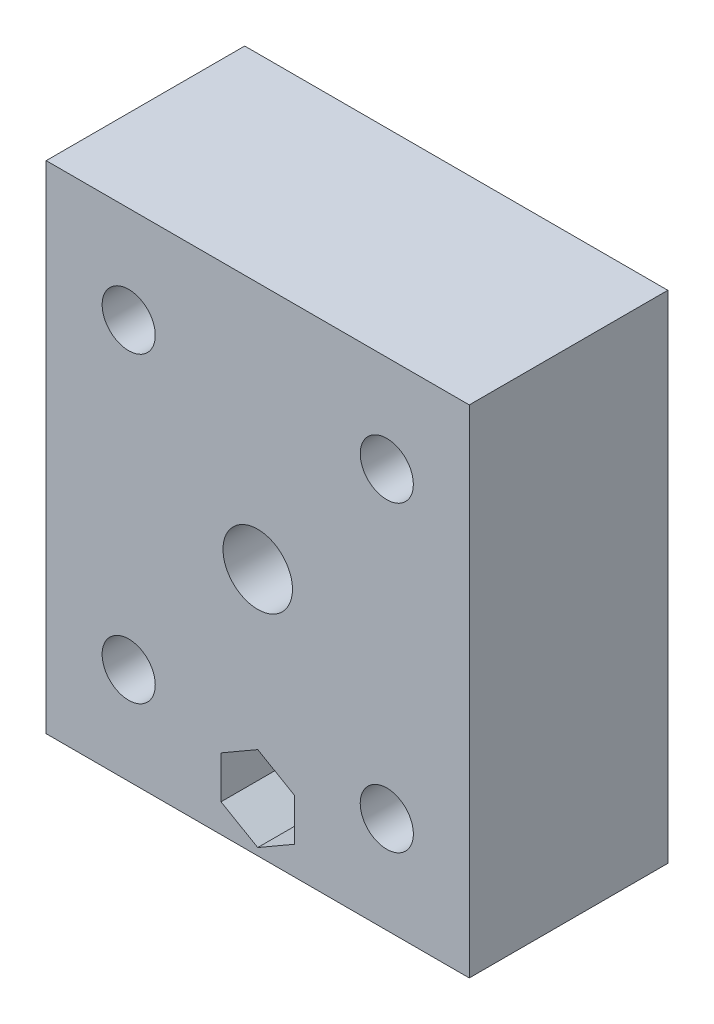
ISO-10303-21;
HEADER;
FILE_DESCRIPTION(('STEP AP214'),'2;1');
FILE_NAME('part.step','',(''),(''),'','','');
FILE_SCHEMA(('AUTOMOTIVE_DESIGN { 1 0 10303 214 1 1 1 1 }'));
ENDSEC;
DATA;
#1=APPLICATION_CONTEXT('core data for automotive mechanical design processes');
#2=APPLICATION_PROTOCOL_DEFINITION('international standard','automotive_design',2000,#1);
#3=PRODUCT_CONTEXT('',#1,'mechanical');
#4=PRODUCT('Part','Part','',(#3));
#5=PRODUCT_RELATED_PRODUCT_CATEGORY('part','',(#4));
#6=PRODUCT_DEFINITION_FORMATION('','',#4);
#7=PRODUCT_DEFINITION_CONTEXT('part definition',#1,'design');
#8=PRODUCT_DEFINITION('design','',#6,#7);
#9=PRODUCT_DEFINITION_SHAPE('','',#8);
#10=(LENGTH_UNIT() NAMED_UNIT(*) SI_UNIT(.MILLI.,.METRE.));
#11=(NAMED_UNIT(*) PLANE_ANGLE_UNIT() SI_UNIT($,.RADIAN.));
#12=(NAMED_UNIT(*) SI_UNIT($,.STERADIAN.) SOLID_ANGLE_UNIT());
#13=UNCERTAINTY_MEASURE_WITH_UNIT(LENGTH_MEASURE(1.E-05),#10,'distance_accuracy_value','');
#14=(GEOMETRIC_REPRESENTATION_CONTEXT(3) GLOBAL_UNCERTAINTY_ASSIGNED_CONTEXT((#13)) GLOBAL_UNIT_ASSIGNED_CONTEXT((#10,
#11,#12)) REPRESENTATION_CONTEXT('',''));
#15=CARTESIAN_POINT('',(0.,0.,0.));
#16=DIRECTION('',(0.,0.,1.));
#17=DIRECTION('',(1.,0.,0.));
#18=AXIS2_PLACEMENT_3D('',#15,#16,#17);
#19=CARTESIAN_POINT('',(0.,0.,20.));
#20=DIRECTION('',(0.,0.,-1.));
#21=DIRECTION('',(-1.,0.,0.));
#22=AXIS2_PLACEMENT_3D('',#19,#20,#21);
#23=PLANE('',#22);
#24=CARTESIAN_POINT('',(0.,0.,20.));
#25=DIRECTION('',(0.,0.,1.));
#26=DIRECTION('',(1.,0.,0.));
#27=AXIS2_PLACEMENT_3D('',#24,#25,#26);
#28=CIRCLE('',#27,3.5);
#29=CARTESIAN_POINT('',(3.5,0.,20.));
#30=VERTEX_POINT('',#29);
#31=EDGE_CURVE('E164',#30,#30,#28,.T.);
#32=ORIENTED_EDGE('',*,*,#31,.F.);
#33=EDGE_LOOP('',(#32));
#34=FACE_BOUND('',#33,.T.);
#35=DIRECTION('',(0.,1.,0.));
#36=VECTOR('',#35,1.);
#37=CARTESIAN_POINT('',(-3.69999999999999,-22.1361959960016,20.));
#38=LINE('',#37,#36);
#39=CARTESIAN_POINT('',(-3.69999999999999,-22.1361959960016,20.));
#40=VERTEX_POINT('',#39);
#41=CARTESIAN_POINT('',(-3.69999999999999,-17.8638040039984,20.));
#42=VERTEX_POINT('',#41);
#43=EDGE_CURVE('E146',#40,#42,#38,.T.);
#44=ORIENTED_EDGE('',*,*,#43,.T.);
#45=DIRECTION('',(0.866025403784439,0.5,0.));
#46=VECTOR('',#45,1.);
#47=CARTESIAN_POINT('',(-3.69999999999999,-17.8638040039984,20.));
#48=LINE('',#47,#46);
#49=CARTESIAN_POINT('',(0.,-15.7276080079968,20.));
#50=VERTEX_POINT('',#49);
#51=EDGE_CURVE('E137',#42,#50,#48,.T.);
#52=ORIENTED_EDGE('',*,*,#51,.T.);
#53=DIRECTION('',(0.866025403784439,-0.499999999999999,0.));
#54=VECTOR('',#53,1.);
#55=CARTESIAN_POINT('',(0.,-15.7276080079968,20.));
#56=LINE('',#55,#54);
#57=CARTESIAN_POINT('',(3.7,-17.8638040039984,20.));
#58=VERTEX_POINT('',#57);
#59=EDGE_CURVE('E149',#50,#58,#56,.T.);
#60=ORIENTED_EDGE('',*,*,#59,.T.);
#61=DIRECTION('',(0.,-1.,0.));
#62=VECTOR('',#61,1.);
#63=CARTESIAN_POINT('',(3.7,-17.8638040039984,20.));
#64=LINE('',#63,#62);
#65=CARTESIAN_POINT('',(3.7,-22.1361959960016,20.));
#66=VERTEX_POINT('',#65);
#67=EDGE_CURVE('E62',#58,#66,#64,.T.);
#68=ORIENTED_EDGE('',*,*,#67,.T.);
#69=DIRECTION('',(-0.866025403784439,-0.5,0.));
#70=VECTOR('',#69,1.);
#71=CARTESIAN_POINT('',(3.7,-22.1361959960016,20.));
#72=LINE('',#71,#70);
#73=CARTESIAN_POINT('',(0.,-24.2723919920032,20.));
#74=VERTEX_POINT('',#73);
#75=EDGE_CURVE('E168',#66,#74,#72,.T.);
#76=ORIENTED_EDGE('',*,*,#75,.T.);
#77=DIRECTION('',(-0.866025403784439,0.5,0.));
#78=VECTOR('',#77,1.);
#79=CARTESIAN_POINT('',(0.,-24.2723919920032,20.));
#80=LINE('',#79,#78);
#81=EDGE_CURVE('E172',#74,#40,#80,.T.);
#82=ORIENTED_EDGE('',*,*,#81,.T.);
#83=EDGE_LOOP('',(#44,#52,#60,#68,#76,#82));
#84=FACE_BOUND('',#83,.T.);
#85=DIRECTION('',(0.,-1.,0.));
#86=VECTOR('',#85,1.);
#87=CARTESIAN_POINT('',(-21.3114754098361,25.,20.));
#88=LINE('',#87,#86);
#89=CARTESIAN_POINT('',(-21.3114754098361,25.,20.));
#90=VERTEX_POINT('',#89);
#91=CARTESIAN_POINT('',(-21.3114754098361,-25.,20.));
#92=VERTEX_POINT('',#91);
#93=EDGE_CURVE('E253',#90,#92,#88,.T.);
#94=ORIENTED_EDGE('',*,*,#93,.T.);
#95=DIRECTION('',(1.,0.,0.));
#96=VECTOR('',#95,1.);
#97=CARTESIAN_POINT('',(21.3114754098361,-25.,20.));
#98=LINE('',#97,#96);
#99=CARTESIAN_POINT('',(21.3114754098361,-25.,20.));
#100=VERTEX_POINT('',#99);
#101=EDGE_CURVE('E99',#92,#100,#98,.T.);
#102=ORIENTED_EDGE('',*,*,#101,.T.);
#103=DIRECTION('',(0.,1.,0.));
#104=VECTOR('',#103,1.);
#105=CARTESIAN_POINT('',(21.3114754098361,25.,20.));
#106=LINE('',#105,#104);
#107=CARTESIAN_POINT('',(21.3114754098361,25.,20.));
#108=VERTEX_POINT('',#107);
#109=EDGE_CURVE('E258',#100,#108,#106,.T.);
#110=ORIENTED_EDGE('',*,*,#109,.T.);
#111=DIRECTION('',(-1.,0.,0.));
#112=VECTOR('',#111,1.);
#113=CARTESIAN_POINT('',(21.3114754098361,25.,20.));
#114=LINE('',#113,#112);
#115=EDGE_CURVE('E71',#108,#90,#114,.T.);
#116=ORIENTED_EDGE('',*,*,#115,.T.);
#117=EDGE_LOOP('',(#94,#102,#110,#116));
#118=FACE_BOUND('',#117,.T.);
#119=CARTESIAN_POINT('',(-13.,-15.25,20.));
#120=DIRECTION('',(0.,0.,1.));
#121=DIRECTION('',(1.,0.,0.));
#122=AXIS2_PLACEMENT_3D('',#119,#120,#121);
#123=CIRCLE('',#122,2.67701813439658);
#124=CARTESIAN_POINT('',(-10.3229818656034,-15.25,20.));
#125=VERTEX_POINT('',#124);
#126=EDGE_CURVE('E245',#125,#125,#123,.T.);
#127=ORIENTED_EDGE('',*,*,#126,.F.);
#128=EDGE_LOOP('',(#127));
#129=FACE_BOUND('',#128,.T.);
#130=CARTESIAN_POINT('',(13.,-15.25,20.));
#131=DIRECTION('',(0.,0.,1.));
#132=DIRECTION('',(-1.,0.,0.));
#133=AXIS2_PLACEMENT_3D('',#130,#131,#132);
#134=CIRCLE('',#133,2.67701813439658);
#135=CARTESIAN_POINT('',(10.3229818656034,-15.25,20.));
#136=VERTEX_POINT('',#135);
#137=EDGE_CURVE('E237',#136,#136,#134,.T.);
#138=ORIENTED_EDGE('',*,*,#137,.F.);
#139=EDGE_LOOP('',(#138));
#140=FACE_BOUND('',#139,.T.);
#141=CARTESIAN_POINT('',(13.,15.25,20.));
#142=DIRECTION('',(0.,0.,1.));
#143=DIRECTION('',(1.,0.,0.));
#144=AXIS2_PLACEMENT_3D('',#141,#142,#143);
#145=CIRCLE('',#144,2.67701813439658);
#146=CARTESIAN_POINT('',(15.6770181343966,15.25,20.));
#147=VERTEX_POINT('',#146);
#148=EDGE_CURVE('E229',#147,#147,#145,.T.);
#149=ORIENTED_EDGE('',*,*,#148,.F.);
#150=EDGE_LOOP('',(#149));
#151=FACE_BOUND('',#150,.T.);
#152=CARTESIAN_POINT('',(-13.,15.25,20.));
#153=DIRECTION('',(0.,0.,1.));
#154=DIRECTION('',(-1.,0.,0.));
#155=AXIS2_PLACEMENT_3D('',#152,#153,#154);
#156=CIRCLE('',#155,2.67701813439658);
#157=CARTESIAN_POINT('',(-15.6770181343966,15.25,20.));
#158=VERTEX_POINT('',#157);
#159=EDGE_CURVE('E221',#158,#158,#156,.T.);
#160=ORIENTED_EDGE('',*,*,#159,.F.);
#161=EDGE_LOOP('',(#160));
#162=FACE_BOUND('',#161,.T.);
#163=ADVANCED_FACE('F44',(#34,#84,#118,#129,#140,#151,#162),#23,.F.);
#164=CARTESIAN_POINT('',(0.,0.,0.));
#165=DIRECTION('',(0.,0.,-1.));
#166=DIRECTION('',(-1.,0.,0.));
#167=AXIS2_PLACEMENT_3D('',#164,#165,#166);
#168=PLANE('',#167);
#169=CARTESIAN_POINT('',(0.,-20.,0.));
#170=DIRECTION('',(0.,0.,-1.));
#171=DIRECTION('',(-1.,0.,0.));
#172=AXIS2_PLACEMENT_3D('',#169,#170,#171);
#173=CIRCLE('',#172,2.2);
#174=CARTESIAN_POINT('',(-2.2,-20.,0.));
#175=VERTEX_POINT('',#174);
#176=EDGE_CURVE('E208',#175,#175,#173,.T.);
#177=ORIENTED_EDGE('',*,*,#176,.F.);
#178=EDGE_LOOP('',(#177));
#179=FACE_BOUND('',#178,.T.);
#180=CARTESIAN_POINT('',(0.,0.,0.));
#181=DIRECTION('',(0.,0.,1.));
#182=DIRECTION('',(1.,0.,0.));
#183=AXIS2_PLACEMENT_3D('',#180,#181,#182);
#184=CIRCLE('',#183,5.025);
#185=CARTESIAN_POINT('',(5.025,0.,0.));
#186=VERTEX_POINT('',#185);
#187=EDGE_CURVE('E212',#186,#186,#184,.T.);
#188=ORIENTED_EDGE('',*,*,#187,.T.);
#189=EDGE_LOOP('',(#188));
#190=FACE_BOUND('',#189,.T.);
#191=CARTESIAN_POINT('',(13.,15.25,0.));
#192=DIRECTION('',(0.,0.,1.));
#193=DIRECTION('',(1.,0.,0.));
#194=AXIS2_PLACEMENT_3D('',#191,#192,#193);
#195=CIRCLE('',#194,2.67701813439658);
#196=CARTESIAN_POINT('',(15.6770181343966,15.25,0.));
#197=VERTEX_POINT('',#196);
#198=EDGE_CURVE('E225',#197,#197,#195,.T.);
#199=ORIENTED_EDGE('',*,*,#198,.T.);
#200=EDGE_LOOP('',(#199));
#201=FACE_BOUND('',#200,.T.);
#202=CARTESIAN_POINT('',(-13.,-15.25,0.));
#203=DIRECTION('',(0.,0.,1.));
#204=DIRECTION('',(1.,0.,0.));
#205=AXIS2_PLACEMENT_3D('',#202,#203,#204);
#206=CIRCLE('',#205,2.67701813439658);
#207=CARTESIAN_POINT('',(-10.3229818656034,-15.25,0.));
#208=VERTEX_POINT('',#207);
#209=EDGE_CURVE('E241',#208,#208,#206,.T.);
#210=ORIENTED_EDGE('',*,*,#209,.T.);
#211=EDGE_LOOP('',(#210));
#212=FACE_BOUND('',#211,.T.);
#213=DIRECTION('',(0.,-1.,0.));
#214=VECTOR('',#213,1.);
#215=CARTESIAN_POINT('',(-21.3114754098361,25.,0.));
#216=LINE('',#215,#214);
#217=CARTESIAN_POINT('',(-21.3114754098361,25.,0.));
#218=VERTEX_POINT('',#217);
#219=CARTESIAN_POINT('',(-21.3114754098361,-25.,0.));
#220=VERTEX_POINT('',#219);
#221=EDGE_CURVE('E249',#218,#220,#216,.T.);
#222=ORIENTED_EDGE('',*,*,#221,.F.);
#223=DIRECTION('',(-1.,0.,0.));
#224=VECTOR('',#223,1.);
#225=CARTESIAN_POINT('',(21.3114754098361,25.,0.));
#226=LINE('',#225,#224);
#227=CARTESIAN_POINT('',(21.3114754098361,25.,0.));
#228=VERTEX_POINT('',#227);
#229=EDGE_CURVE('E92',#228,#218,#226,.T.);
#230=ORIENTED_EDGE('',*,*,#229,.F.);
#231=DIRECTION('',(0.,1.,0.));
#232=VECTOR('',#231,1.);
#233=CARTESIAN_POINT('',(21.3114754098361,25.,0.));
#234=LINE('',#233,#232);
#235=CARTESIAN_POINT('',(21.3114754098361,-25.,0.));
#236=VERTEX_POINT('',#235);
#237=EDGE_CURVE('E270',#236,#228,#234,.T.);
#238=ORIENTED_EDGE('',*,*,#237,.F.);
#239=DIRECTION('',(1.,0.,0.));
#240=VECTOR('',#239,1.);
#241=CARTESIAN_POINT('',(21.3114754098361,-25.,0.));
#242=LINE('',#241,#240);
#243=EDGE_CURVE('E267',#220,#236,#242,.T.);
#244=ORIENTED_EDGE('',*,*,#243,.F.);
#245=EDGE_LOOP('',(#222,#230,#238,#244));
#246=FACE_BOUND('',#245,.T.);
#247=CARTESIAN_POINT('',(13.,-15.25,0.));
#248=DIRECTION('',(0.,0.,1.));
#249=DIRECTION('',(-1.,0.,0.));
#250=AXIS2_PLACEMENT_3D('',#247,#248,#249);
#251=CIRCLE('',#250,2.67701813439658);
#252=CARTESIAN_POINT('',(10.3229818656034,-15.25,0.));
#253=VERTEX_POINT('',#252);
#254=EDGE_CURVE('E233',#253,#253,#251,.T.);
#255=ORIENTED_EDGE('',*,*,#254,.T.);
#256=EDGE_LOOP('',(#255));
#257=FACE_BOUND('',#256,.T.);
#258=CARTESIAN_POINT('',(-13.,15.25,0.));
#259=DIRECTION('',(0.,0.,1.));
#260=DIRECTION('',(-1.,0.,0.));
#261=AXIS2_PLACEMENT_3D('',#258,#259,#260);
#262=CIRCLE('',#261,2.67701813439658);
#263=CARTESIAN_POINT('',(-15.6770181343966,15.25,0.));
#264=VERTEX_POINT('',#263);
#265=EDGE_CURVE('E217',#264,#264,#262,.T.);
#266=ORIENTED_EDGE('',*,*,#265,.T.);
#267=EDGE_LOOP('',(#266));
#268=FACE_BOUND('',#267,.T.);
#269=ADVANCED_FACE('F304',(#179,#190,#201,#212,#246,#257,#268),#168,.T.);
#270=CARTESIAN_POINT('',(-21.3114754098361,25.,20.));
#271=DIRECTION('',(1.,0.,0.));
#272=DIRECTION('',(0.,0.,-1.));
#273=AXIS2_PLACEMENT_3D('',#270,#271,#272);
#274=PLANE('',#273);
#275=ORIENTED_EDGE('',*,*,#221,.T.);
#276=DIRECTION('',(0.,0.,-1.));
#277=VECTOR('',#276,1.);
#278=CARTESIAN_POINT('',(-21.3114754098361,-25.,20.));
#279=LINE('',#278,#277);
#280=EDGE_CURVE('E11',#92,#220,#279,.T.);
#281=ORIENTED_EDGE('',*,*,#280,.F.);
#282=ORIENTED_EDGE('',*,*,#93,.F.);
#283=DIRECTION('',(0.,0.,-1.));
#284=VECTOR('',#283,1.);
#285=CARTESIAN_POINT('',(-21.3114754098361,25.,20.));
#286=LINE('',#285,#284);
#287=EDGE_CURVE('E263',#90,#218,#286,.T.);
#288=ORIENTED_EDGE('',*,*,#287,.T.);
#289=EDGE_LOOP('',(#275,#281,#282,#288));
#290=FACE_BOUND('',#289,.T.);
#291=ADVANCED_FACE('F46',(#290),#274,.F.);
#292=CARTESIAN_POINT('',(21.3114754098361,-25.,20.));
#293=DIRECTION('',(0.,1.,0.));
#294=DIRECTION('',(0.,0.,1.));
#295=AXIS2_PLACEMENT_3D('',#292,#293,#294);
#296=PLANE('',#295);
#297=ORIENTED_EDGE('',*,*,#243,.T.);
#298=DIRECTION('',(0.,0.,-1.));
#299=VECTOR('',#298,1.);
#300=CARTESIAN_POINT('',(21.3114754098361,-25.,20.));
#301=LINE('',#300,#299);
#302=EDGE_CURVE('E54',#100,#236,#301,.T.);
#303=ORIENTED_EDGE('',*,*,#302,.F.);
#304=ORIENTED_EDGE('',*,*,#101,.F.);
#305=ORIENTED_EDGE('',*,*,#280,.T.);
#306=EDGE_LOOP('',(#297,#303,#304,#305));
#307=FACE_BOUND('',#306,.T.);
#308=ADVANCED_FACE('F324',(#307),#296,.F.);
#309=CARTESIAN_POINT('',(21.3114754098361,25.,20.));
#310=DIRECTION('',(-1.,0.,0.));
#311=DIRECTION('',(0.,0.,1.));
#312=AXIS2_PLACEMENT_3D('',#309,#310,#311);
#313=PLANE('',#312);
#314=ORIENTED_EDGE('',*,*,#237,.T.);
#315=DIRECTION('',(0.,0.,-1.));
#316=VECTOR('',#315,1.);
#317=CARTESIAN_POINT('',(21.3114754098361,25.,20.));
#318=LINE('',#317,#316);
#319=EDGE_CURVE('E277',#108,#228,#318,.T.);
#320=ORIENTED_EDGE('',*,*,#319,.F.);
#321=ORIENTED_EDGE('',*,*,#109,.F.);
#322=ORIENTED_EDGE('',*,*,#302,.T.);
#323=EDGE_LOOP('',(#314,#320,#321,#322));
#324=FACE_BOUND('',#323,.T.);
#325=ADVANCED_FACE('F322',(#324),#313,.F.);
#326=CARTESIAN_POINT('',(21.3114754098361,25.,20.));
#327=DIRECTION('',(0.,-1.,0.));
#328=DIRECTION('',(0.,0.,-1.));
#329=AXIS2_PLACEMENT_3D('',#326,#327,#328);
#330=PLANE('',#329);
#331=ORIENTED_EDGE('',*,*,#229,.T.);
#332=ORIENTED_EDGE('',*,*,#287,.F.);
#333=ORIENTED_EDGE('',*,*,#115,.F.);
#334=ORIENTED_EDGE('',*,*,#319,.T.);
#335=EDGE_LOOP('',(#331,#332,#333,#334));
#336=FACE_BOUND('',#335,.T.);
#337=ADVANCED_FACE('F319',(#336),#330,.F.);
#338=CARTESIAN_POINT('',(-13.,-15.25,20.));
#339=DIRECTION('',(0.,0.,-1.));
#340=DIRECTION('',(-1.,0.,0.));
#341=AXIS2_PLACEMENT_3D('',#338,#339,#340);
#342=CYLINDRICAL_SURFACE('',#341,2.67701813439658);
#343=ORIENTED_EDGE('',*,*,#126,.T.);
#344=EDGE_LOOP('',(#343));
#345=FACE_BOUND('',#344,.T.);
#346=ORIENTED_EDGE('',*,*,#209,.F.);
#347=EDGE_LOOP('',(#346));
#348=FACE_BOUND('',#347,.T.);
#349=ADVANCED_FACE('F316',(#345,#348),#342,.F.);
#350=CARTESIAN_POINT('',(13.,-15.25,20.));
#351=DIRECTION('',(0.,0.,-1.));
#352=DIRECTION('',(-1.,0.,0.));
#353=AXIS2_PLACEMENT_3D('',#350,#351,#352);
#354=CYLINDRICAL_SURFACE('',#353,2.67701813439658);
#355=ORIENTED_EDGE('',*,*,#137,.T.);
#356=EDGE_LOOP('',(#355));
#357=FACE_BOUND('',#356,.T.);
#358=ORIENTED_EDGE('',*,*,#254,.F.);
#359=EDGE_LOOP('',(#358));
#360=FACE_BOUND('',#359,.T.);
#361=ADVANCED_FACE('F362',(#357,#360),#354,.F.);
#362=CARTESIAN_POINT('',(13.,15.25,20.));
#363=DIRECTION('',(0.,0.,-1.));
#364=DIRECTION('',(-1.,0.,0.));
#365=AXIS2_PLACEMENT_3D('',#362,#363,#364);
#366=CYLINDRICAL_SURFACE('',#365,2.67701813439658);
#367=ORIENTED_EDGE('',*,*,#148,.T.);
#368=EDGE_LOOP('',(#367));
#369=FACE_BOUND('',#368,.T.);
#370=ORIENTED_EDGE('',*,*,#198,.F.);
#371=EDGE_LOOP('',(#370));
#372=FACE_BOUND('',#371,.T.);
#373=ADVANCED_FACE('F352',(#369,#372),#366,.F.);
#374=CARTESIAN_POINT('',(-13.,15.25,20.));
#375=DIRECTION('',(0.,0.,-1.));
#376=DIRECTION('',(-1.,0.,0.));
#377=AXIS2_PLACEMENT_3D('',#374,#375,#376);
#378=CYLINDRICAL_SURFACE('',#377,2.67701813439658);
#379=ORIENTED_EDGE('',*,*,#159,.T.);
#380=EDGE_LOOP('',(#379));
#381=FACE_BOUND('',#380,.T.);
#382=ORIENTED_EDGE('',*,*,#265,.F.);
#383=EDGE_LOOP('',(#382));
#384=FACE_BOUND('',#383,.T.);
#385=ADVANCED_FACE('F348',(#381,#384),#378,.F.);
#386=CARTESIAN_POINT('',(0.,0.,3.));
#387=DIRECTION('',(0.,0.,-1.));
#388=DIRECTION('',(-1.,0.,0.));
#389=AXIS2_PLACEMENT_3D('',#386,#387,#388);
#390=CYLINDRICAL_SURFACE('',#389,5.025);
#391=CARTESIAN_POINT('',(0.,0.,3.));
#392=DIRECTION('',(0.,0.,1.));
#393=DIRECTION('',(1.,0.,0.));
#394=AXIS2_PLACEMENT_3D('',#391,#392,#393);
#395=CIRCLE('',#394,5.025);
#396=CARTESIAN_POINT('',(5.025,0.,3.));
#397=VERTEX_POINT('',#396);
#398=EDGE_CURVE('E213',#397,#397,#395,.T.);
#399=ORIENTED_EDGE('',*,*,#398,.T.);
#400=EDGE_LOOP('',(#399));
#401=FACE_BOUND('',#400,.T.);
#402=ORIENTED_EDGE('',*,*,#187,.F.);
#403=EDGE_LOOP('',(#402));
#404=FACE_BOUND('',#403,.T.);
#405=ADVANCED_FACE('F351',(#401,#404),#390,.F.);
#406=CARTESIAN_POINT('',(0.,0.,3.));
#407=DIRECTION('',(0.,0.,1.));
#408=DIRECTION('',(1.,0.,0.));
#409=AXIS2_PLACEMENT_3D('',#406,#407,#408);
#410=PLANE('',#409);
#411=CARTESIAN_POINT('',(0.,0.,3.));
#412=DIRECTION('',(0.,0.,1.));
#413=DIRECTION('',(1.,0.,0.));
#414=AXIS2_PLACEMENT_3D('',#411,#412,#413);
#415=CIRCLE('',#414,3.5);
#416=CARTESIAN_POINT('',(3.5,0.,3.));
#417=VERTEX_POINT('',#416);
#418=EDGE_CURVE('E48',#417,#417,#415,.F.);
#419=ORIENTED_EDGE('',*,*,#418,.F.);
#420=EDGE_LOOP('',(#419));
#421=FACE_BOUND('',#420,.T.);
#422=ORIENTED_EDGE('',*,*,#398,.F.);
#423=EDGE_LOOP('',(#422));
#424=FACE_BOUND('',#423,.T.);
#425=ADVANCED_FACE('F299',(#421,#424),#410,.F.);
#426=CARTESIAN_POINT('',(0.,-20.,10.));
#427=DIRECTION('',(0.,0.,-1.));
#428=DIRECTION('',(-1.,0.,0.));
#429=AXIS2_PLACEMENT_3D('',#426,#427,#428);
#430=CYLINDRICAL_SURFACE('',#429,2.2);
#431=CARTESIAN_POINT('',(0.,-20.,7.));
#432=DIRECTION('',(0.,0.,-1.));
#433=DIRECTION('',(-1.,0.,0.));
#434=AXIS2_PLACEMENT_3D('',#431,#432,#433);
#435=CIRCLE('',#434,2.2);
#436=CARTESIAN_POINT('',(-2.2,-20.,7.));
#437=VERTEX_POINT('',#436);
#438=EDGE_CURVE('E196',#437,#437,#435,.F.);
#439=ORIENTED_EDGE('',*,*,#438,.T.);
#440=EDGE_LOOP('',(#439));
#441=FACE_BOUND('',#440,.T.);
#442=ORIENTED_EDGE('',*,*,#176,.T.);
#443=EDGE_LOOP('',(#442));
#444=FACE_BOUND('',#443,.T.);
#445=ADVANCED_FACE('F286',(#441,#444),#430,.F.);
#446=CARTESIAN_POINT('',(0.,0.,7.));
#447=DIRECTION('',(0.,0.,-1.));
#448=DIRECTION('',(-1.,0.,0.));
#449=AXIS2_PLACEMENT_3D('',#446,#447,#448);
#450=PLANE('',#449);
#451=DIRECTION('',(0.866025403784439,0.5,0.));
#452=VECTOR('',#451,1.);
#453=CARTESIAN_POINT('',(-3.69999999999999,-17.8638040039984,7.));
#454=LINE('',#453,#452);
#455=CARTESIAN_POINT('',(-3.69999999999999,-17.8638040039984,7.));
#456=VERTEX_POINT('',#455);
#457=CARTESIAN_POINT('',(0.,-15.7276080079968,7.));
#458=VERTEX_POINT('',#457);
#459=EDGE_CURVE('E140',#456,#458,#454,.T.);
#460=ORIENTED_EDGE('',*,*,#459,.F.);
#461=DIRECTION('',(0.,1.,0.));
#462=VECTOR('',#461,1.);
#463=CARTESIAN_POINT('',(-3.69999999999999,-22.1361959960016,7.));
#464=LINE('',#463,#462);
#465=CARTESIAN_POINT('',(-3.69999999999999,-22.1361959960016,7.));
#466=VERTEX_POINT('',#465);
#467=EDGE_CURVE('E157',#466,#456,#464,.T.);
#468=ORIENTED_EDGE('',*,*,#467,.F.);
#469=DIRECTION('',(-0.866025403784439,0.5,0.));
#470=VECTOR('',#469,1.);
#471=CARTESIAN_POINT('',(0.,-24.2723919920032,7.));
#472=LINE('',#471,#470);
#473=CARTESIAN_POINT('',(0.,-24.2723919920032,7.));
#474=VERTEX_POINT('',#473);
#475=EDGE_CURVE('E161',#474,#466,#472,.T.);
#476=ORIENTED_EDGE('',*,*,#475,.F.);
#477=DIRECTION('',(-0.866025403784439,-0.5,0.));
#478=VECTOR('',#477,1.);
#479=CARTESIAN_POINT('',(3.7,-22.1361959960016,7.));
#480=LINE('',#479,#478);
#481=CARTESIAN_POINT('',(3.7,-22.1361959960016,7.));
#482=VERTEX_POINT('',#481);
#483=EDGE_CURVE('E186',#482,#474,#480,.T.);
#484=ORIENTED_EDGE('',*,*,#483,.F.);
#485=DIRECTION('',(0.,-1.,0.));
#486=VECTOR('',#485,1.);
#487=CARTESIAN_POINT('',(3.7,-17.8638040039984,7.));
#488=LINE('',#487,#486);
#489=CARTESIAN_POINT('',(3.7,-17.8638040039984,7.));
#490=VERTEX_POINT('',#489);
#491=EDGE_CURVE('E182',#490,#482,#488,.T.);
#492=ORIENTED_EDGE('',*,*,#491,.F.);
#493=DIRECTION('',(0.866025403784439,-0.499999999999999,0.));
#494=VECTOR('',#493,1.);
#495=CARTESIAN_POINT('',(0.,-15.7276080079968,7.));
#496=LINE('',#495,#494);
#497=EDGE_CURVE('E179',#458,#490,#496,.T.);
#498=ORIENTED_EDGE('',*,*,#497,.F.);
#499=EDGE_LOOP('',(#460,#468,#476,#484,#492,#498));
#500=FACE_BOUND('',#499,.T.);
#501=ORIENTED_EDGE('',*,*,#438,.F.);
#502=EDGE_LOOP('',(#501));
#503=FACE_BOUND('',#502,.T.);
#504=ADVANCED_FACE('F289',(#500,#503),#450,.F.);
#505=CARTESIAN_POINT('',(-3.69999999999999,-17.8638040039984,20.));
#506=DIRECTION('',(-0.5,0.866025403784439,0.));
#507=DIRECTION('',(-0.866025403784439,-0.5,0.));
#508=AXIS2_PLACEMENT_3D('',#505,#506,#507);
#509=PLANE('',#508);
#510=ORIENTED_EDGE('',*,*,#459,.T.);
#511=DIRECTION('',(0.,0.,-1.));
#512=VECTOR('',#511,1.);
#513=CARTESIAN_POINT('',(0.,-15.7276080079968,20.));
#514=LINE('',#513,#512);
#515=EDGE_CURVE('E133',#50,#458,#514,.T.);
#516=ORIENTED_EDGE('',*,*,#515,.F.);
#517=ORIENTED_EDGE('',*,*,#51,.F.);
#518=DIRECTION('',(0.,0.,-1.));
#519=VECTOR('',#518,1.);
#520=CARTESIAN_POINT('',(-3.69999999999999,-17.8638040039984,20.));
#521=LINE('',#520,#519);
#522=EDGE_CURVE('E193',#42,#456,#521,.T.);
#523=ORIENTED_EDGE('',*,*,#522,.T.);
#524=EDGE_LOOP('',(#510,#516,#517,#523));
#525=FACE_BOUND('',#524,.T.);
#526=ADVANCED_FACE('F135',(#525),#509,.F.);
#527=CARTESIAN_POINT('',(-3.69999999999999,-22.1361959960016,20.));
#528=DIRECTION('',(-1.,0.,0.));
#529=DIRECTION('',(0.,-1.,0.));
#530=AXIS2_PLACEMENT_3D('',#527,#528,#529);
#531=PLANE('',#530);
#532=ORIENTED_EDGE('',*,*,#467,.T.);
#533=ORIENTED_EDGE('',*,*,#522,.F.);
#534=ORIENTED_EDGE('',*,*,#43,.F.);
#535=DIRECTION('',(0.,0.,-1.));
#536=VECTOR('',#535,1.);
#537=CARTESIAN_POINT('',(-3.69999999999999,-22.1361959960016,20.));
#538=LINE('',#537,#536);
#539=EDGE_CURVE('E197',#40,#466,#538,.T.);
#540=ORIENTED_EDGE('',*,*,#539,.T.);
#541=EDGE_LOOP('',(#532,#533,#534,#540));
#542=FACE_BOUND('',#541,.T.);
#543=ADVANCED_FACE('F297',(#542),#531,.F.);
#544=CARTESIAN_POINT('',(0.,-24.2723919920032,20.));
#545=DIRECTION('',(-0.5,-0.866025403784439,0.));
#546=DIRECTION('',(0.866025403784439,-0.5,0.));
#547=AXIS2_PLACEMENT_3D('',#544,#545,#546);
#548=PLANE('',#547);
#549=ORIENTED_EDGE('',*,*,#475,.T.);
#550=ORIENTED_EDGE('',*,*,#539,.F.);
#551=ORIENTED_EDGE('',*,*,#81,.F.);
#552=DIRECTION('',(0.,0.,-1.));
#553=VECTOR('',#552,1.);
#554=CARTESIAN_POINT('',(0.,-24.2723919920032,20.));
#555=LINE('',#554,#553);
#556=EDGE_CURVE('E200',#74,#474,#555,.T.);
#557=ORIENTED_EDGE('',*,*,#556,.T.);
#558=EDGE_LOOP('',(#549,#550,#551,#557));
#559=FACE_BOUND('',#558,.T.);
#560=ADVANCED_FACE('F441',(#559),#548,.F.);
#561=CARTESIAN_POINT('',(3.7,-22.1361959960016,20.));
#562=DIRECTION('',(0.5,-0.866025403784439,0.));
#563=DIRECTION('',(0.866025403784439,0.5,0.));
#564=AXIS2_PLACEMENT_3D('',#561,#562,#563);
#565=PLANE('',#564);
#566=ORIENTED_EDGE('',*,*,#483,.T.);
#567=ORIENTED_EDGE('',*,*,#556,.F.);
#568=ORIENTED_EDGE('',*,*,#75,.F.);
#569=DIRECTION('',(0.,0.,-1.));
#570=VECTOR('',#569,1.);
#571=CARTESIAN_POINT('',(3.7,-22.1361959960016,20.));
#572=LINE('',#571,#570);
#573=EDGE_CURVE('E203',#66,#482,#572,.T.);
#574=ORIENTED_EDGE('',*,*,#573,.T.);
#575=EDGE_LOOP('',(#566,#567,#568,#574));
#576=FACE_BOUND('',#575,.T.);
#577=ADVANCED_FACE('F450',(#576),#565,.F.);
#578=CARTESIAN_POINT('',(3.7,-17.8638040039984,20.));
#579=DIRECTION('',(1.,0.,0.));
#580=DIRECTION('',(0.,0.,-1.));
#581=AXIS2_PLACEMENT_3D('',#578,#579,#580);
#582=PLANE('',#581);
#583=ORIENTED_EDGE('',*,*,#491,.T.);
#584=ORIENTED_EDGE('',*,*,#573,.F.);
#585=ORIENTED_EDGE('',*,*,#67,.F.);
#586=DIRECTION('',(0.,0.,-1.));
#587=VECTOR('',#586,1.);
#588=CARTESIAN_POINT('',(3.7,-17.8638040039984,20.));
#589=LINE('',#588,#587);
#590=EDGE_CURVE('E145',#58,#490,#589,.T.);
#591=ORIENTED_EDGE('',*,*,#590,.T.);
#592=EDGE_LOOP('',(#583,#584,#585,#591));
#593=FACE_BOUND('',#592,.T.);
#594=ADVANCED_FACE('F460',(#593),#582,.F.);
#595=CARTESIAN_POINT('',(0.,-15.7276080079968,20.));
#596=DIRECTION('',(0.499999999999999,0.866025403784439,0.));
#597=DIRECTION('',(-0.866025403784439,0.499999999999999,0.));
#598=AXIS2_PLACEMENT_3D('',#595,#596,#597);
#599=PLANE('',#598);
#600=ORIENTED_EDGE('',*,*,#497,.T.);
#601=ORIENTED_EDGE('',*,*,#590,.F.);
#602=ORIENTED_EDGE('',*,*,#59,.F.);
#603=ORIENTED_EDGE('',*,*,#515,.T.);
#604=EDGE_LOOP('',(#600,#601,#602,#603));
#605=FACE_BOUND('',#604,.T.);
#606=ADVANCED_FACE('F150',(#605),#599,.F.);
#607=CARTESIAN_POINT('',(0.,0.,20.));
#608=DIRECTION('',(0.,0.,-1.));
#609=DIRECTION('',(-1.,0.,0.));
#610=AXIS2_PLACEMENT_3D('',#607,#608,#609);
#611=CYLINDRICAL_SURFACE('',#610,3.5);
#612=ORIENTED_EDGE('',*,*,#31,.T.);
#613=EDGE_LOOP('',(#612));
#614=FACE_BOUND('',#613,.T.);
#615=ORIENTED_EDGE('',*,*,#418,.T.);
#616=EDGE_LOOP('',(#615));
#617=FACE_BOUND('',#616,.T.);
#618=ADVANCED_FACE('F477',(#614,#617),#611,.F.);
#619=CLOSED_SHELL('',(#163,#269,#291,#308,#325,#337,#349,#361,#373,#385,#405,#425,#445,#504,
#526,#543,#560,#577,#594,#606,#618));
#620=MANIFOLD_SOLID_BREP('B2',#619);
#621=ADVANCED_BREP_SHAPE_REPRESENTATION('',(#18,#620),#14);
#622=SHAPE_DEFINITION_REPRESENTATION(#9,#621);
ENDSEC;
END-ISO-10303-21;
